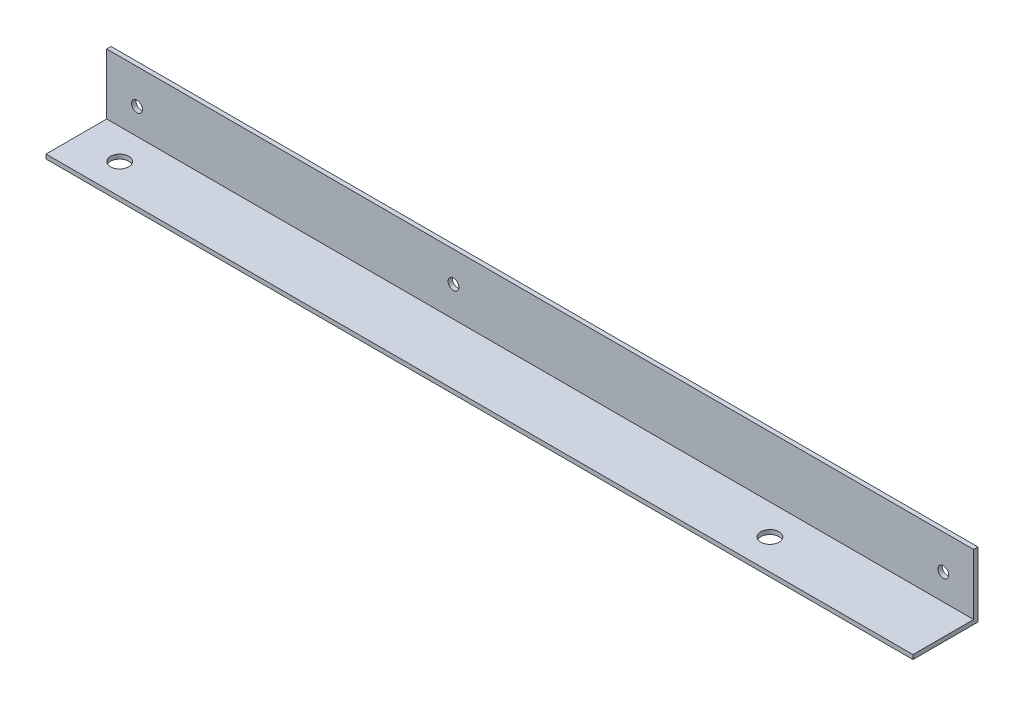
ISO-10303-21;
HEADER;
FILE_DESCRIPTION(('STEP AP214'),'2;1');
FILE_NAME('part.step','',(''),(''),'','','');
FILE_SCHEMA(('AUTOMOTIVE_DESIGN { 1 0 10303 214 1 1 1 1 }'));
ENDSEC;
DATA;
#1=APPLICATION_CONTEXT('core data for automotive mechanical design processes');
#2=APPLICATION_PROTOCOL_DEFINITION('international standard','automotive_design',2000,#1);
#3=PRODUCT_CONTEXT('',#1,'mechanical');
#4=PRODUCT('Part','Part','',(#3));
#5=PRODUCT_RELATED_PRODUCT_CATEGORY('part','',(#4));
#6=PRODUCT_DEFINITION_FORMATION('','',#4);
#7=PRODUCT_DEFINITION_CONTEXT('part definition',#1,'design');
#8=PRODUCT_DEFINITION('design','',#6,#7);
#9=PRODUCT_DEFINITION_SHAPE('','',#8);
#10=(LENGTH_UNIT() NAMED_UNIT(*) SI_UNIT(.MILLI.,.METRE.));
#11=(NAMED_UNIT(*) PLANE_ANGLE_UNIT() SI_UNIT($,.RADIAN.));
#12=(NAMED_UNIT(*) SI_UNIT($,.STERADIAN.) SOLID_ANGLE_UNIT());
#13=UNCERTAINTY_MEASURE_WITH_UNIT(LENGTH_MEASURE(1.E-05),#10,'distance_accuracy_value','');
#14=(GEOMETRIC_REPRESENTATION_CONTEXT(3) GLOBAL_UNCERTAINTY_ASSIGNED_CONTEXT((#13)) GLOBAL_UNIT_ASSIGNED_CONTEXT((#10,
#11,#12)) REPRESENTATION_CONTEXT('',''));
#15=CARTESIAN_POINT('',(0.,0.,0.));
#16=DIRECTION('',(0.,0.,1.));
#17=DIRECTION('',(1.,0.,0.));
#18=AXIS2_PLACEMENT_3D('',#15,#16,#17);
#19=CARTESIAN_POINT('',(0.,0.,1.));
#20=DIRECTION('',(0.,0.,-1.));
#21=DIRECTION('',(-1.,0.,0.));
#22=AXIS2_PLACEMENT_3D('',#19,#20,#21);
#23=PLANE('',#22);
#24=CARTESIAN_POINT('',(7.00000000000001,7.,1.));
#25=DIRECTION('',(0.,0.,-1.));
#26=DIRECTION('',(-1.,0.,0.));
#27=AXIS2_PLACEMENT_3D('',#24,#25,#26);
#28=CIRCLE('',#27,1.25);
#29=CARTESIAN_POINT('',(5.75000000000001,7.,1.));
#30=VERTEX_POINT('',#29);
#31=EDGE_CURVE('E202',#30,#30,#28,.T.);
#32=ORIENTED_EDGE('',*,*,#31,.T.);
#33=EDGE_LOOP('',(#32));
#34=FACE_BOUND('',#33,.T.);
#35=CARTESIAN_POINT('',(80.,8.,1.));
#36=DIRECTION('',(0.,0.,1.));
#37=DIRECTION('',(1.,0.,0.));
#38=AXIS2_PLACEMENT_3D('',#35,#36,#37);
#39=CIRCLE('',#38,1.24999999999999);
#40=CARTESIAN_POINT('',(81.25,8.,1.));
#41=VERTEX_POINT('',#40);
#42=EDGE_CURVE('E199',#41,#41,#39,.T.);
#43=ORIENTED_EDGE('',*,*,#42,.F.);
#44=EDGE_LOOP('',(#43));
#45=FACE_BOUND('',#44,.T.);
#46=CARTESIAN_POINT('',(193.,7.,1.));
#47=DIRECTION('',(0.,0.,-1.));
#48=DIRECTION('',(-1.,0.,0.));
#49=AXIS2_PLACEMENT_3D('',#46,#47,#48);
#50=CIRCLE('',#49,1.25);
#51=CARTESIAN_POINT('',(191.75,7.,1.));
#52=VERTEX_POINT('',#51);
#53=EDGE_CURVE('E190',#52,#52,#50,.T.);
#54=ORIENTED_EDGE('',*,*,#53,.T.);
#55=EDGE_LOOP('',(#54));
#56=FACE_BOUND('',#55,.T.);
#57=DIRECTION('',(-1.,0.,0.));
#58=VECTOR('',#57,1.);
#59=CARTESIAN_POINT('',(0.,1.,1.));
#60=LINE('',#59,#58);
#61=CARTESIAN_POINT('',(200.,1.,1.));
#62=VERTEX_POINT('',#61);
#63=CARTESIAN_POINT('',(0.,1.,1.));
#64=VERTEX_POINT('',#63);
#65=EDGE_CURVE('E49',#62,#64,#60,.T.);
#66=ORIENTED_EDGE('',*,*,#65,.F.);
#67=DIRECTION('',(0.,1.,0.));
#68=VECTOR('',#67,1.);
#69=CARTESIAN_POINT('',(200.,0.,1.));
#70=LINE('',#69,#68);
#71=CARTESIAN_POINT('',(200.,15.,1.));
#72=VERTEX_POINT('',#71);
#73=EDGE_CURVE('E138',#62,#72,#70,.T.);
#74=ORIENTED_EDGE('',*,*,#73,.T.);
#75=DIRECTION('',(-1.,0.,0.));
#76=VECTOR('',#75,1.);
#77=CARTESIAN_POINT('',(0.,15.,1.));
#78=LINE('',#77,#76);
#79=CARTESIAN_POINT('',(0.,15.,1.));
#80=VERTEX_POINT('',#79);
#81=EDGE_CURVE('E55',#72,#80,#78,.T.);
#82=ORIENTED_EDGE('',*,*,#81,.T.);
#83=DIRECTION('',(0.,-1.,0.));
#84=VECTOR('',#83,1.);
#85=CARTESIAN_POINT('',(0.,0.,1.));
#86=LINE('',#85,#84);
#87=EDGE_CURVE('E84',#80,#64,#86,.T.);
#88=ORIENTED_EDGE('',*,*,#87,.T.);
#89=EDGE_LOOP('',(#66,#74,#82,#88));
#90=FACE_BOUND('',#89,.T.);
#91=ADVANCED_FACE('F34',(#34,#45,#56,#90),#23,.F.);
#92=CARTESIAN_POINT('',(0.,0.,1.));
#93=DIRECTION('',(1.,0.,0.));
#94=DIRECTION('',(0.,0.,-1.));
#95=AXIS2_PLACEMENT_3D('',#92,#93,#94);
#96=PLANE('',#95);
#97=DIRECTION('',(0.,-1.,0.));
#98=VECTOR('',#97,1.);
#99=CARTESIAN_POINT('',(0.,0.,0.));
#100=LINE('',#99,#98);
#101=CARTESIAN_POINT('',(0.,15.,0.));
#102=VERTEX_POINT('',#101);
#103=CARTESIAN_POINT('',(0.,0.,0.));
#104=VERTEX_POINT('',#103);
#105=EDGE_CURVE('E90',#102,#104,#100,.T.);
#106=ORIENTED_EDGE('',*,*,#105,.T.);
#107=DIRECTION('',(0.,0.,-1.));
#108=VECTOR('',#107,1.);
#109=CARTESIAN_POINT('',(0.,0.,1.));
#110=LINE('',#109,#108);
#111=CARTESIAN_POINT('',(0.,0.,15.));
#112=VERTEX_POINT('',#111);
#113=EDGE_CURVE('E11',#112,#104,#110,.T.);
#114=ORIENTED_EDGE('',*,*,#113,.F.);
#115=DIRECTION('',(0.,-1.,0.));
#116=VECTOR('',#115,1.);
#117=CARTESIAN_POINT('',(0.,0.,15.));
#118=LINE('',#117,#116);
#119=CARTESIAN_POINT('',(0.,1.,15.));
#120=VERTEX_POINT('',#119);
#121=EDGE_CURVE('E127',#120,#112,#118,.T.);
#122=ORIENTED_EDGE('',*,*,#121,.F.);
#123=DIRECTION('',(0.,0.,-1.));
#124=VECTOR('',#123,1.);
#125=CARTESIAN_POINT('',(0.,1.,15.));
#126=LINE('',#125,#124);
#127=EDGE_CURVE('E99',#120,#64,#126,.T.);
#128=ORIENTED_EDGE('',*,*,#127,.T.);
#129=ORIENTED_EDGE('',*,*,#87,.F.);
#130=DIRECTION('',(0.,0.,-1.));
#131=VECTOR('',#130,1.);
#132=CARTESIAN_POINT('',(0.,15.,1.));
#133=LINE('',#132,#131);
#134=EDGE_CURVE('E77',#80,#102,#133,.T.);
#135=ORIENTED_EDGE('',*,*,#134,.T.);
#136=EDGE_LOOP('',(#106,#114,#122,#128,#129,#135));
#137=FACE_BOUND('',#136,.T.);
#138=ADVANCED_FACE('F36',(#137),#96,.F.);
#139=CARTESIAN_POINT('',(0.,0.,1.));
#140=DIRECTION('',(0.,1.,0.));
#141=DIRECTION('',(0.,0.,1.));
#142=AXIS2_PLACEMENT_3D('',#139,#140,#141);
#143=PLANE('',#142);
#144=CARTESIAN_POINT('',(10.,0.,8.));
#145=DIRECTION('',(0.,-1.,0.));
#146=DIRECTION('',(0.,0.,-1.));
#147=AXIS2_PLACEMENT_3D('',#144,#145,#146);
#148=CIRCLE('',#147,2.09999999999999);
#149=CARTESIAN_POINT('',(10.,0.,5.90000000000001));
#150=VERTEX_POINT('',#149);
#151=EDGE_CURVE('E179',#150,#150,#148,.T.);
#152=ORIENTED_EDGE('',*,*,#151,.F.);
#153=EDGE_LOOP('',(#152));
#154=FACE_BOUND('',#153,.T.);
#155=CARTESIAN_POINT('',(160.,0.,8.));
#156=DIRECTION('',(0.,-1.,0.));
#157=DIRECTION('',(0.,0.,-1.));
#158=AXIS2_PLACEMENT_3D('',#155,#156,#157);
#159=CIRCLE('',#158,2.09999999999999);
#160=CARTESIAN_POINT('',(160.,0.,5.90000000000001));
#161=VERTEX_POINT('',#160);
#162=EDGE_CURVE('E182',#161,#161,#159,.T.);
#163=ORIENTED_EDGE('',*,*,#162,.F.);
#164=EDGE_LOOP('',(#163));
#165=FACE_BOUND('',#164,.T.);
#166=DIRECTION('',(1.,0.,0.));
#167=VECTOR('',#166,1.);
#168=CARTESIAN_POINT('',(0.,0.,0.));
#169=LINE('',#168,#167);
#170=CARTESIAN_POINT('',(200.,0.,0.));
#171=VERTEX_POINT('',#170);
#172=EDGE_CURVE('E94',#104,#171,#169,.T.);
#173=ORIENTED_EDGE('',*,*,#172,.T.);
#174=DIRECTION('',(0.,0.,-1.));
#175=VECTOR('',#174,1.);
#176=CARTESIAN_POINT('',(200.,0.,1.));
#177=LINE('',#176,#175);
#178=CARTESIAN_POINT('',(200.,0.,15.));
#179=VERTEX_POINT('',#178);
#180=EDGE_CURVE('E42',#179,#171,#177,.T.);
#181=ORIENTED_EDGE('',*,*,#180,.F.);
#182=DIRECTION('',(1.,0.,0.));
#183=VECTOR('',#182,1.);
#184=CARTESIAN_POINT('',(0.,0.,15.));
#185=LINE('',#184,#183);
#186=EDGE_CURVE('E119',#112,#179,#185,.T.);
#187=ORIENTED_EDGE('',*,*,#186,.F.);
#188=ORIENTED_EDGE('',*,*,#113,.T.);
#189=EDGE_LOOP('',(#173,#181,#187,#188));
#190=FACE_BOUND('',#189,.T.);
#191=ADVANCED_FACE('F117',(#154,#165,#190),#143,.F.);
#192=CARTESIAN_POINT('',(200.,0.,1.));
#193=DIRECTION('',(-1.,0.,0.));
#194=DIRECTION('',(0.,0.,1.));
#195=AXIS2_PLACEMENT_3D('',#192,#193,#194);
#196=PLANE('',#195);
#197=DIRECTION('',(0.,1.,0.));
#198=VECTOR('',#197,1.);
#199=CARTESIAN_POINT('',(200.,0.,0.));
#200=LINE('',#199,#198);
#201=CARTESIAN_POINT('',(200.,15.,0.));
#202=VERTEX_POINT('',#201);
#203=EDGE_CURVE('E85',#171,#202,#200,.T.);
#204=ORIENTED_EDGE('',*,*,#203,.T.);
#205=DIRECTION('',(0.,0.,-1.));
#206=VECTOR('',#205,1.);
#207=CARTESIAN_POINT('',(200.,15.,1.));
#208=LINE('',#207,#206);
#209=EDGE_CURVE('E80',#72,#202,#208,.T.);
#210=ORIENTED_EDGE('',*,*,#209,.F.);
#211=ORIENTED_EDGE('',*,*,#73,.F.);
#212=DIRECTION('',(0.,0.,-1.));
#213=VECTOR('',#212,1.);
#214=CARTESIAN_POINT('',(200.,1.,15.));
#215=LINE('',#214,#213);
#216=CARTESIAN_POINT('',(200.,1.,15.));
#217=VERTEX_POINT('',#216);
#218=EDGE_CURVE('E95',#217,#62,#215,.T.);
#219=ORIENTED_EDGE('',*,*,#218,.F.);
#220=DIRECTION('',(0.,1.,0.));
#221=VECTOR('',#220,1.);
#222=CARTESIAN_POINT('',(200.,0.,15.));
#223=LINE('',#222,#221);
#224=EDGE_CURVE('E113',#179,#217,#223,.T.);
#225=ORIENTED_EDGE('',*,*,#224,.F.);
#226=ORIENTED_EDGE('',*,*,#180,.T.);
#227=EDGE_LOOP('',(#204,#210,#211,#219,#225,#226));
#228=FACE_BOUND('',#227,.T.);
#229=ADVANCED_FACE('F109',(#228),#196,.F.);
#230=CARTESIAN_POINT('',(0.,15.,1.));
#231=DIRECTION('',(0.,-1.,0.));
#232=DIRECTION('',(0.,0.,-1.));
#233=AXIS2_PLACEMENT_3D('',#230,#231,#232);
#234=PLANE('',#233);
#235=DIRECTION('',(-1.,0.,0.));
#236=VECTOR('',#235,1.);
#237=CARTESIAN_POINT('',(0.,15.,0.));
#238=LINE('',#237,#236);
#239=EDGE_CURVE('E74',#202,#102,#238,.T.);
#240=ORIENTED_EDGE('',*,*,#239,.T.);
#241=ORIENTED_EDGE('',*,*,#134,.F.);
#242=ORIENTED_EDGE('',*,*,#81,.F.);
#243=ORIENTED_EDGE('',*,*,#209,.T.);
#244=EDGE_LOOP('',(#240,#241,#242,#243));
#245=FACE_BOUND('',#244,.T.);
#246=ADVANCED_FACE('F76',(#245),#234,.F.);
#247=CARTESIAN_POINT('',(0.,0.,0.));
#248=DIRECTION('',(0.,0.,-1.));
#249=DIRECTION('',(-1.,0.,0.));
#250=AXIS2_PLACEMENT_3D('',#247,#248,#249);
#251=PLANE('',#250);
#252=CARTESIAN_POINT('',(7.00000000000001,7.,0.));
#253=DIRECTION('',(0.,0.,-1.));
#254=DIRECTION('',(-1.,0.,0.));
#255=AXIS2_PLACEMENT_3D('',#252,#253,#254);
#256=CIRCLE('',#255,1.25);
#257=CARTESIAN_POINT('',(5.75000000000001,7.,0.));
#258=VERTEX_POINT('',#257);
#259=EDGE_CURVE('E204',#258,#258,#256,.T.);
#260=ORIENTED_EDGE('',*,*,#259,.F.);
#261=EDGE_LOOP('',(#260));
#262=FACE_BOUND('',#261,.T.);
#263=CARTESIAN_POINT('',(80.,8.,0.));
#264=DIRECTION('',(0.,0.,1.));
#265=DIRECTION('',(1.,0.,0.));
#266=AXIS2_PLACEMENT_3D('',#263,#264,#265);
#267=CIRCLE('',#266,1.24999999999999);
#268=CARTESIAN_POINT('',(81.25,8.,0.));
#269=VERTEX_POINT('',#268);
#270=EDGE_CURVE('E196',#269,#269,#267,.T.);
#271=ORIENTED_EDGE('',*,*,#270,.T.);
#272=EDGE_LOOP('',(#271));
#273=FACE_BOUND('',#272,.T.);
#274=CARTESIAN_POINT('',(193.,7.,0.));
#275=DIRECTION('',(0.,0.,-1.));
#276=DIRECTION('',(-1.,0.,0.));
#277=AXIS2_PLACEMENT_3D('',#274,#275,#276);
#278=CIRCLE('',#277,1.25);
#279=CARTESIAN_POINT('',(191.75,7.,0.));
#280=VERTEX_POINT('',#279);
#281=EDGE_CURVE('E193',#280,#280,#278,.T.);
#282=ORIENTED_EDGE('',*,*,#281,.F.);
#283=EDGE_LOOP('',(#282));
#284=FACE_BOUND('',#283,.T.);
#285=ORIENTED_EDGE('',*,*,#105,.F.);
#286=ORIENTED_EDGE('',*,*,#239,.F.);
#287=ORIENTED_EDGE('',*,*,#203,.F.);
#288=ORIENTED_EDGE('',*,*,#172,.F.);
#289=EDGE_LOOP('',(#285,#286,#287,#288));
#290=FACE_BOUND('',#289,.T.);
#291=ADVANCED_FACE('F93',(#262,#273,#284,#290),#251,.T.);
#292=CARTESIAN_POINT('',(0.,1.,15.));
#293=DIRECTION('',(0.,-1.,0.));
#294=DIRECTION('',(0.,0.,-1.));
#295=AXIS2_PLACEMENT_3D('',#292,#293,#294);
#296=PLANE('',#295);
#297=CARTESIAN_POINT('',(10.,1.,8.));
#298=DIRECTION('',(0.,-1.,0.));
#299=DIRECTION('',(0.,0.,-1.));
#300=AXIS2_PLACEMENT_3D('',#297,#298,#299);
#301=CIRCLE('',#300,2.09999999999999);
#302=CARTESIAN_POINT('',(10.,1.,5.90000000000001));
#303=VERTEX_POINT('',#302);
#304=EDGE_CURVE('E184',#303,#303,#301,.T.);
#305=ORIENTED_EDGE('',*,*,#304,.T.);
#306=EDGE_LOOP('',(#305));
#307=FACE_BOUND('',#306,.T.);
#308=CARTESIAN_POINT('',(160.,1.,8.));
#309=DIRECTION('',(0.,-1.,0.));
#310=DIRECTION('',(0.,0.,-1.));
#311=AXIS2_PLACEMENT_3D('',#308,#309,#310);
#312=CIRCLE('',#311,2.09999999999999);
#313=CARTESIAN_POINT('',(160.,1.,5.90000000000001));
#314=VERTEX_POINT('',#313);
#315=EDGE_CURVE('E136',#314,#314,#312,.T.);
#316=ORIENTED_EDGE('',*,*,#315,.T.);
#317=EDGE_LOOP('',(#316));
#318=FACE_BOUND('',#317,.T.);
#319=ORIENTED_EDGE('',*,*,#65,.T.);
#320=ORIENTED_EDGE('',*,*,#127,.F.);
#321=DIRECTION('',(-1.,0.,0.));
#322=VECTOR('',#321,1.);
#323=CARTESIAN_POINT('',(0.,1.,15.));
#324=LINE('',#323,#322);
#325=EDGE_CURVE('E129',#217,#120,#324,.T.);
#326=ORIENTED_EDGE('',*,*,#325,.F.);
#327=ORIENTED_EDGE('',*,*,#218,.T.);
#328=EDGE_LOOP('',(#319,#320,#326,#327));
#329=FACE_BOUND('',#328,.T.);
#330=ADVANCED_FACE('F141',(#307,#318,#329),#296,.F.);
#331=CARTESIAN_POINT('',(0.,0.,15.));
#332=DIRECTION('',(0.,0.,-1.));
#333=DIRECTION('',(-1.,0.,0.));
#334=AXIS2_PLACEMENT_3D('',#331,#332,#333);
#335=PLANE('',#334);
#336=ORIENTED_EDGE('',*,*,#121,.T.);
#337=ORIENTED_EDGE('',*,*,#186,.T.);
#338=ORIENTED_EDGE('',*,*,#224,.T.);
#339=ORIENTED_EDGE('',*,*,#325,.T.);
#340=EDGE_LOOP('',(#336,#337,#338,#339));
#341=FACE_BOUND('',#340,.T.);
#342=ADVANCED_FACE('F124',(#341),#335,.F.);
#343=CARTESIAN_POINT('',(160.,0.,8.));
#344=DIRECTION('',(0.,-1.,0.));
#345=DIRECTION('',(0.,0.,-1.));
#346=AXIS2_PLACEMENT_3D('',#343,#344,#345);
#347=CYLINDRICAL_SURFACE('',#346,2.09999999999999);
#348=ORIENTED_EDGE('',*,*,#162,.T.);
#349=EDGE_LOOP('',(#348));
#350=FACE_BOUND('',#349,.T.);
#351=ORIENTED_EDGE('',*,*,#315,.F.);
#352=EDGE_LOOP('',(#351));
#353=FACE_BOUND('',#352,.T.);
#354=ADVANCED_FACE('F154',(#350,#353),#347,.F.);
#355=CARTESIAN_POINT('',(10.,0.,8.));
#356=DIRECTION('',(0.,-1.,0.));
#357=DIRECTION('',(0.,0.,-1.));
#358=AXIS2_PLACEMENT_3D('',#355,#356,#357);
#359=CYLINDRICAL_SURFACE('',#358,2.09999999999999);
#360=ORIENTED_EDGE('',*,*,#151,.T.);
#361=EDGE_LOOP('',(#360));
#362=FACE_BOUND('',#361,.T.);
#363=ORIENTED_EDGE('',*,*,#304,.F.);
#364=EDGE_LOOP('',(#363));
#365=FACE_BOUND('',#364,.T.);
#366=ADVANCED_FACE('F219',(#362,#365),#359,.F.);
#367=CARTESIAN_POINT('',(193.,7.,0.));
#368=DIRECTION('',(0.,0.,-1.));
#369=DIRECTION('',(-1.,0.,0.));
#370=AXIS2_PLACEMENT_3D('',#367,#368,#369);
#371=CYLINDRICAL_SURFACE('',#370,1.25);
#372=ORIENTED_EDGE('',*,*,#281,.T.);
#373=EDGE_LOOP('',(#372));
#374=FACE_BOUND('',#373,.T.);
#375=ORIENTED_EDGE('',*,*,#53,.F.);
#376=EDGE_LOOP('',(#375));
#377=FACE_BOUND('',#376,.T.);
#378=ADVANCED_FACE('F215',(#374,#377),#371,.F.);
#379=CARTESIAN_POINT('',(80.,8.,1.));
#380=DIRECTION('',(0.,0.,1.));
#381=DIRECTION('',(1.,0.,0.));
#382=AXIS2_PLACEMENT_3D('',#379,#380,#381);
#383=CYLINDRICAL_SURFACE('',#382,1.24999999999999);
#384=ORIENTED_EDGE('',*,*,#270,.F.);
#385=EDGE_LOOP('',(#384));
#386=FACE_BOUND('',#385,.T.);
#387=ORIENTED_EDGE('',*,*,#42,.T.);
#388=EDGE_LOOP('',(#387));
#389=FACE_BOUND('',#388,.T.);
#390=ADVANCED_FACE('F218',(#386,#389),#383,.F.);
#391=CARTESIAN_POINT('',(7.00000000000001,7.,0.));
#392=DIRECTION('',(0.,0.,-1.));
#393=DIRECTION('',(-1.,0.,0.));
#394=AXIS2_PLACEMENT_3D('',#391,#392,#393);
#395=CYLINDRICAL_SURFACE('',#394,1.25);
#396=ORIENTED_EDGE('',*,*,#259,.T.);
#397=EDGE_LOOP('',(#396));
#398=FACE_BOUND('',#397,.T.);
#399=ORIENTED_EDGE('',*,*,#31,.F.);
#400=EDGE_LOOP('',(#399));
#401=FACE_BOUND('',#400,.T.);
#402=ADVANCED_FACE('F208',(#398,#401),#395,.F.);
#403=CLOSED_SHELL('',(#91,#138,#191,#229,#246,#291,#330,#342,#354,#366,#378,#390,#402));
#404=MANIFOLD_SOLID_BREP('B2',#403);
#405=ADVANCED_BREP_SHAPE_REPRESENTATION('',(#18,#404),#14);
#406=SHAPE_DEFINITION_REPRESENTATION(#9,#405);
ENDSEC;
END-ISO-10303-21;
